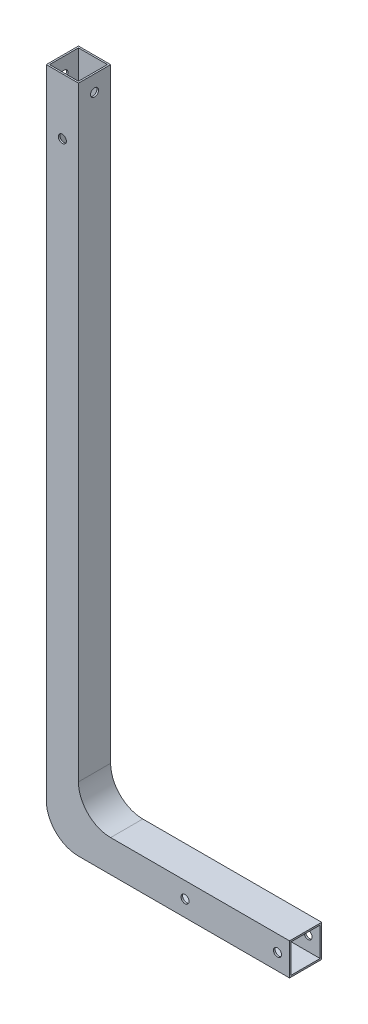
ISO-10303-21;
HEADER;
FILE_DESCRIPTION(('STEP AP214'),'2;1');
FILE_NAME('part.step','',(''),(''),'','','');
FILE_SCHEMA(('AUTOMOTIVE_DESIGN { 1 0 10303 214 1 1 1 1 }'));
ENDSEC;
DATA;
#1=APPLICATION_CONTEXT('core data for automotive mechanical design processes');
#2=APPLICATION_PROTOCOL_DEFINITION('international standard','automotive_design',2000,#1);
#3=PRODUCT_CONTEXT('',#1,'mechanical');
#4=PRODUCT('Part','Part','',(#3));
#5=PRODUCT_RELATED_PRODUCT_CATEGORY('part','',(#4));
#6=PRODUCT_DEFINITION_FORMATION('','',#4);
#7=PRODUCT_DEFINITION_CONTEXT('part definition',#1,'design');
#8=PRODUCT_DEFINITION('design','',#6,#7);
#9=PRODUCT_DEFINITION_SHAPE('','',#8);
#10=(LENGTH_UNIT() NAMED_UNIT(*) SI_UNIT(.MILLI.,.METRE.));
#11=(NAMED_UNIT(*) PLANE_ANGLE_UNIT() SI_UNIT($,.RADIAN.));
#12=(NAMED_UNIT(*) SI_UNIT($,.STERADIAN.) SOLID_ANGLE_UNIT());
#13=UNCERTAINTY_MEASURE_WITH_UNIT(LENGTH_MEASURE(1.E-05),#10,'distance_accuracy_value','');
#14=(GEOMETRIC_REPRESENTATION_CONTEXT(3) GLOBAL_UNCERTAINTY_ASSIGNED_CONTEXT((#13)) GLOBAL_UNIT_ASSIGNED_CONTEXT((#10,
#11,#12)) REPRESENTATION_CONTEXT('',''));
#15=CARTESIAN_POINT('',(0.,0.,0.));
#16=DIRECTION('',(0.,0.,1.));
#17=DIRECTION('',(1.,0.,0.));
#18=AXIS2_PLACEMENT_3D('',#15,#16,#17);
#19=CARTESIAN_POINT('',(50.8,50.8,0.));
#20=DIRECTION('',(0.,0.,-1.));
#21=DIRECTION('',(-1.,0.,0.));
#22=AXIS2_PLACEMENT_3D('',#19,#20,#21);
#23=PLANE('',#22);
#24=CARTESIAN_POINT('',(25.4,968.375,0.));
#25=DIRECTION('',(0.,0.,1.));
#26=DIRECTION('',(1.,0.,0.));
#27=AXIS2_PLACEMENT_3D('',#24,#25,#26);
#28=CIRCLE('',#27,6.34999999999995);
#29=CARTESIAN_POINT('',(31.7499999999999,968.375,0.));
#30=VERTEX_POINT('',#29);
#31=EDGE_CURVE('E621',#30,#30,#28,.T.);
#32=ORIENTED_EDGE('',*,*,#31,.T.);
#33=EDGE_LOOP('',(#32));
#34=FACE_BOUND('',#33,.T.);
#35=CARTESIAN_POINT('',(365.125,25.4,0.));
#36=DIRECTION('',(0.,0.,1.));
#37=DIRECTION('',(1.,0.,0.));
#38=AXIS2_PLACEMENT_3D('',#35,#36,#37);
#39=CIRCLE('',#38,6.34999999999997);
#40=CARTESIAN_POINT('',(371.475,25.4,0.));
#41=VERTEX_POINT('',#40);
#42=EDGE_CURVE('E333',#41,#41,#39,.T.);
#43=ORIENTED_EDGE('',*,*,#42,.T.);
#44=EDGE_LOOP('',(#43));
#45=FACE_BOUND('',#44,.T.);
#46=DIRECTION('',(-1.,0.,0.));
#47=VECTOR('',#46,1.);
#48=CARTESIAN_POINT('',(50.8000000000002,1057.275,0.));
#49=LINE('',#48,#47);
#50=CARTESIAN_POINT('',(50.8000000000002,1057.275,0.));
#51=VERTEX_POINT('',#50);
#52=CARTESIAN_POINT('',(1.66533453693773E-13,1057.275,0.));
#53=VERTEX_POINT('',#52);
#54=EDGE_CURVE('E238',#51,#53,#49,.T.);
#55=ORIENTED_EDGE('',*,*,#54,.F.);
#56=DIRECTION('',(0.,1.,0.));
#57=VECTOR('',#56,1.);
#58=CARTESIAN_POINT('',(50.8,101.6,0.));
#59=LINE('',#58,#57);
#60=CARTESIAN_POINT('',(50.8,101.6,0.));
#61=VERTEX_POINT('',#60);
#62=EDGE_CURVE('E252',#61,#51,#59,.T.);
#63=ORIENTED_EDGE('',*,*,#62,.F.);
#64=CARTESIAN_POINT('',(101.6,101.6,0.));
#65=DIRECTION('',(0.,0.,-1.));
#66=DIRECTION('',(1.,0.,0.));
#67=AXIS2_PLACEMENT_3D('',#64,#65,#66);
#68=CIRCLE('',#67,50.8);
#69=CARTESIAN_POINT('',(101.600000000001,50.8,0.));
#70=VERTEX_POINT('',#69);
#71=EDGE_CURVE('E292',#70,#61,#68,.T.);
#72=ORIENTED_EDGE('',*,*,#71,.F.);
#73=DIRECTION('',(-1.,0.,0.));
#74=VECTOR('',#73,1.);
#75=CARTESIAN_POINT('',(384.175000000001,50.8,0.));
#76=LINE('',#75,#74);
#77=CARTESIAN_POINT('',(384.175000000001,50.8,0.));
#78=VERTEX_POINT('',#77);
#79=EDGE_CURVE('E289',#78,#70,#76,.T.);
#80=ORIENTED_EDGE('',*,*,#79,.F.);
#81=DIRECTION('',(0.,1.,0.));
#82=VECTOR('',#81,1.);
#83=CARTESIAN_POINT('',(384.175000000001,0.,0.));
#84=LINE('',#83,#82);
#85=CARTESIAN_POINT('',(384.175000000001,0.,0.));
#86=VERTEX_POINT('',#85);
#87=EDGE_CURVE('E286',#86,#78,#84,.T.);
#88=ORIENTED_EDGE('',*,*,#87,.F.);
#89=DIRECTION('',(1.,0.,0.));
#90=VECTOR('',#89,1.);
#91=CARTESIAN_POINT('',(50.8000000000003,0.,0.));
#92=LINE('',#91,#90);
#93=CARTESIAN_POINT('',(50.8000000000003,0.,0.));
#94=VERTEX_POINT('',#93);
#95=EDGE_CURVE('E283',#94,#86,#92,.T.);
#96=ORIENTED_EDGE('',*,*,#95,.F.);
#97=CARTESIAN_POINT('',(50.8,50.8,0.));
#98=DIRECTION('',(0.,0.,1.));
#99=DIRECTION('',(-1.,0.,0.));
#100=AXIS2_PLACEMENT_3D('',#97,#98,#99);
#101=CIRCLE('',#100,50.8);
#102=CARTESIAN_POINT('',(0.,50.8000000000004,0.));
#103=VERTEX_POINT('',#102);
#104=EDGE_CURVE('E280',#103,#94,#101,.T.);
#105=ORIENTED_EDGE('',*,*,#104,.F.);
#106=DIRECTION('',(0.,-1.,0.));
#107=VECTOR('',#106,1.);
#108=CARTESIAN_POINT('',(1.66533453693773E-13,1057.275,0.));
#109=LINE('',#108,#107);
#110=EDGE_CURVE('E277',#53,#103,#109,.T.);
#111=ORIENTED_EDGE('',*,*,#110,.F.);
#112=EDGE_LOOP('',(#55,#63,#72,#80,#88,#96,#105,#111));
#113=FACE_BOUND('',#112,.T.);
#114=CARTESIAN_POINT('',(219.075,25.4,0.));
#115=DIRECTION('',(0.,0.,1.));
#116=DIRECTION('',(1.,0.,0.));
#117=AXIS2_PLACEMENT_3D('',#114,#115,#116);
#118=CIRCLE('',#117,6.34999999999999);
#119=CARTESIAN_POINT('',(225.425,25.4,0.));
#120=VERTEX_POINT('',#119);
#121=EDGE_CURVE('E328',#120,#120,#118,.T.);
#122=ORIENTED_EDGE('',*,*,#121,.T.);
#123=EDGE_LOOP('',(#122));
#124=FACE_BOUND('',#123,.T.);
#125=ADVANCED_FACE('F40',(#34,#45,#113,#124),#23,.T.);
#126=CARTESIAN_POINT('',(50.8,1057.275,50.8000000000001));
#127=DIRECTION('',(0.,-1.,0.));
#128=DIRECTION('',(0.,0.,-1.));
#129=AXIS2_PLACEMENT_3D('',#126,#127,#128);
#130=PLANE('',#129);
#131=ORIENTED_EDGE('',*,*,#54,.T.);
#132=DIRECTION('',(0.,0.,-1.));
#133=VECTOR('',#132,1.);
#134=CARTESIAN_POINT('',(0.,1057.275,50.8000000000001));
#135=LINE('',#134,#133);
#136=CARTESIAN_POINT('',(0.,1057.275,50.8000000000001));
#137=VERTEX_POINT('',#136);
#138=EDGE_CURVE('E11',#137,#53,#135,.T.);
#139=ORIENTED_EDGE('',*,*,#138,.F.);
#140=DIRECTION('',(-1.,0.,0.));
#141=VECTOR('',#140,1.);
#142=CARTESIAN_POINT('',(50.8,1057.275,50.8000000000001));
#143=LINE('',#142,#141);
#144=CARTESIAN_POINT('',(50.8,1057.275,50.8000000000001));
#145=VERTEX_POINT('',#144);
#146=EDGE_CURVE('E247',#145,#137,#143,.T.);
#147=ORIENTED_EDGE('',*,*,#146,.F.);
#148=DIRECTION('',(0.,0.,-1.));
#149=VECTOR('',#148,1.);
#150=CARTESIAN_POINT('',(50.8,1057.275,50.8000000000001));
#151=LINE('',#150,#149);
#152=EDGE_CURVE('E273',#145,#51,#151,.T.);
#153=ORIENTED_EDGE('',*,*,#152,.T.);
#154=EDGE_LOOP('',(#131,#139,#147,#153));
#155=FACE_BOUND('',#154,.T.);
#156=DIRECTION('',(-1.,0.,0.));
#157=VECTOR('',#156,1.);
#158=CARTESIAN_POINT('',(50.8000000000001,1057.275,2.54));
#159=LINE('',#158,#157);
#160=CARTESIAN_POINT('',(48.2600000000002,1057.275,2.54));
#161=VERTEX_POINT('',#160);
#162=CARTESIAN_POINT('',(2.54000000000015,1057.275,2.54));
#163=VERTEX_POINT('',#162);
#164=EDGE_CURVE('E184',#161,#163,#159,.T.);
#165=ORIENTED_EDGE('',*,*,#164,.F.);
#166=DIRECTION('',(0.,0.,-1.));
#167=VECTOR('',#166,1.);
#168=CARTESIAN_POINT('',(48.26,1057.275,50.8000000000001));
#169=LINE('',#168,#167);
#170=CARTESIAN_POINT('',(48.26,1057.275,48.2600000000001));
#171=VERTEX_POINT('',#170);
#172=EDGE_CURVE('E227',#171,#161,#169,.T.);
#173=ORIENTED_EDGE('',*,*,#172,.F.);
#174=DIRECTION('',(-1.,0.,0.));
#175=VECTOR('',#174,1.);
#176=CARTESIAN_POINT('',(50.8,1057.275,48.2600000000001));
#177=LINE('',#176,#175);
#178=CARTESIAN_POINT('',(2.53999999999999,1057.275,48.2600000000001));
#179=VERTEX_POINT('',#178);
#180=EDGE_CURVE('E66',#171,#179,#177,.T.);
#181=ORIENTED_EDGE('',*,*,#180,.T.);
#182=DIRECTION('',(0.,0.,-1.));
#183=VECTOR('',#182,1.);
#184=CARTESIAN_POINT('',(2.53999999999999,1057.275,50.8000000000001));
#185=LINE('',#184,#183);
#186=EDGE_CURVE('E196',#179,#163,#185,.T.);
#187=ORIENTED_EDGE('',*,*,#186,.T.);
#188=EDGE_LOOP('',(#165,#173,#181,#187));
#189=FACE_BOUND('',#188,.T.);
#190=ADVANCED_FACE('F42',(#155,#189),#130,.F.);
#191=CARTESIAN_POINT('',(0.,1057.275,50.8000000000001));
#192=DIRECTION('',(1.,0.,0.));
#193=DIRECTION('',(0.,0.,-1.));
#194=AXIS2_PLACEMENT_3D('',#191,#192,#193);
#195=PLANE('',#194);
#196=CARTESIAN_POINT('',(0.,1031.875,25.4));
#197=DIRECTION('',(-1.,0.,0.));
#198=DIRECTION('',(0.,0.,1.));
#199=AXIS2_PLACEMENT_3D('',#196,#197,#198);
#200=CIRCLE('',#199,6.35000000000008);
#201=CARTESIAN_POINT('',(0.,1031.875,31.7500000000001));
#202=VERTEX_POINT('',#201);
#203=EDGE_CURVE('E338',#202,#202,#200,.T.);
#204=ORIENTED_EDGE('',*,*,#203,.F.);
#205=EDGE_LOOP('',(#204));
#206=FACE_BOUND('',#205,.T.);
#207=ORIENTED_EDGE('',*,*,#110,.T.);
#208=DIRECTION('',(0.,0.,-1.));
#209=VECTOR('',#208,1.);
#210=CARTESIAN_POINT('',(0.,50.8000000000004,50.8000000000001));
#211=LINE('',#210,#209);
#212=CARTESIAN_POINT('',(0.,50.8000000000004,50.8000000000001));
#213=VERTEX_POINT('',#212);
#214=EDGE_CURVE('E50',#213,#103,#211,.T.);
#215=ORIENTED_EDGE('',*,*,#214,.F.);
#216=DIRECTION('',(0.,-1.,0.));
#217=VECTOR('',#216,1.);
#218=CARTESIAN_POINT('',(0.,1057.275,50.8000000000001));
#219=LINE('',#218,#217);
#220=EDGE_CURVE('E251',#137,#213,#219,.T.);
#221=ORIENTED_EDGE('',*,*,#220,.F.);
#222=ORIENTED_EDGE('',*,*,#138,.T.);
#223=EDGE_LOOP('',(#207,#215,#221,#222));
#224=FACE_BOUND('',#223,.T.);
#225=ADVANCED_FACE('F421',(#206,#224),#195,.F.);
#226=CARTESIAN_POINT('',(50.8,50.8,50.8000000000001));
#227=DIRECTION('',(0.,0.,-1.));
#228=DIRECTION('',(-1.,0.,0.));
#229=AXIS2_PLACEMENT_3D('',#226,#227,#228);
#230=CYLINDRICAL_SURFACE('',#229,50.8);
#231=ORIENTED_EDGE('',*,*,#104,.T.);
#232=DIRECTION('',(0.,0.,-1.));
#233=VECTOR('',#232,1.);
#234=CARTESIAN_POINT('',(50.8000000000003,0.,50.8000000000001));
#235=LINE('',#234,#233);
#236=CARTESIAN_POINT('',(50.8000000000003,0.,50.8000000000001));
#237=VERTEX_POINT('',#236);
#238=EDGE_CURVE('E316',#237,#94,#235,.T.);
#239=ORIENTED_EDGE('',*,*,#238,.F.);
#240=CARTESIAN_POINT('',(50.8,50.8,50.8000000000001));
#241=DIRECTION('',(0.,0.,1.));
#242=DIRECTION('',(-1.,0.,0.));
#243=AXIS2_PLACEMENT_3D('',#240,#241,#242);
#244=CIRCLE('',#243,50.8);
#245=EDGE_CURVE('E255',#213,#237,#244,.T.);
#246=ORIENTED_EDGE('',*,*,#245,.F.);
#247=ORIENTED_EDGE('',*,*,#214,.T.);
#248=EDGE_LOOP('',(#231,#239,#246,#247));
#249=FACE_BOUND('',#248,.T.);
#250=ADVANCED_FACE('F446',(#249),#230,.T.);
#251=CARTESIAN_POINT('',(50.8000000000004,0.,50.8000000000001));
#252=DIRECTION('',(0.,1.,0.));
#253=DIRECTION('',(0.,0.,1.));
#254=AXIS2_PLACEMENT_3D('',#251,#252,#253);
#255=PLANE('',#254);
#256=ORIENTED_EDGE('',*,*,#95,.T.);
#257=DIRECTION('',(0.,0.,-1.));
#258=VECTOR('',#257,1.);
#259=CARTESIAN_POINT('',(384.175000000001,0.,50.8000000000001));
#260=LINE('',#259,#258);
#261=CARTESIAN_POINT('',(384.175000000001,0.,50.8000000000001));
#262=VERTEX_POINT('',#261);
#263=EDGE_CURVE('E312',#262,#86,#260,.T.);
#264=ORIENTED_EDGE('',*,*,#263,.F.);
#265=DIRECTION('',(1.,0.,0.));
#266=VECTOR('',#265,1.);
#267=CARTESIAN_POINT('',(50.8000000000004,0.,50.8000000000001));
#268=LINE('',#267,#266);
#269=EDGE_CURVE('E258',#237,#262,#268,.T.);
#270=ORIENTED_EDGE('',*,*,#269,.F.);
#271=ORIENTED_EDGE('',*,*,#238,.T.);
#272=EDGE_LOOP('',(#256,#264,#270,#271));
#273=FACE_BOUND('',#272,.T.);
#274=ADVANCED_FACE('F443',(#273),#255,.F.);
#275=CARTESIAN_POINT('',(384.175000000001,0.,50.8000000000001));
#276=DIRECTION('',(-1.,0.,0.));
#277=DIRECTION('',(0.,0.,1.));
#278=AXIS2_PLACEMENT_3D('',#275,#276,#277);
#279=PLANE('',#278);
#280=DIRECTION('',(0.,0.,1.));
#281=VECTOR('',#280,1.);
#282=CARTESIAN_POINT('',(384.175000000001,48.26,2.54));
#283=LINE('',#282,#281);
#284=CARTESIAN_POINT('',(384.175000000001,48.26,2.54));
#285=VERTEX_POINT('',#284);
#286=CARTESIAN_POINT('',(384.175000000001,48.26,48.2600000000001));
#287=VERTEX_POINT('',#286);
#288=EDGE_CURVE('E169',#285,#287,#283,.T.);
#289=ORIENTED_EDGE('',*,*,#288,.F.);
#290=DIRECTION('',(0.,1.,0.));
#291=VECTOR('',#290,1.);
#292=CARTESIAN_POINT('',(384.175000000001,2.53999999999996,2.54));
#293=LINE('',#292,#291);
#294=CARTESIAN_POINT('',(384.175000000001,2.53999999999996,2.54));
#295=VERTEX_POINT('',#294);
#296=EDGE_CURVE('E174',#295,#285,#293,.T.);
#297=ORIENTED_EDGE('',*,*,#296,.F.);
#298=DIRECTION('',(0.,0.,-1.));
#299=VECTOR('',#298,1.);
#300=CARTESIAN_POINT('',(384.175000000001,2.53999999999996,2.54));
#301=LINE('',#300,#299);
#302=CARTESIAN_POINT('',(384.175000000001,2.53999999999996,48.2600000000001));
#303=VERTEX_POINT('',#302);
#304=EDGE_CURVE('E179',#303,#295,#301,.T.);
#305=ORIENTED_EDGE('',*,*,#304,.F.);
#306=DIRECTION('',(0.,-1.,0.));
#307=VECTOR('',#306,1.);
#308=CARTESIAN_POINT('',(384.175000000001,2.53999999999996,48.2600000000001));
#309=LINE('',#308,#307);
#310=EDGE_CURVE('E161',#287,#303,#309,.T.);
#311=ORIENTED_EDGE('',*,*,#310,.F.);
#312=EDGE_LOOP('',(#289,#297,#305,#311));
#313=FACE_BOUND('',#312,.T.);
#314=ORIENTED_EDGE('',*,*,#87,.T.);
#315=DIRECTION('',(0.,0.,-1.));
#316=VECTOR('',#315,1.);
#317=CARTESIAN_POINT('',(384.175000000001,50.8,50.8000000000001));
#318=LINE('',#317,#316);
#319=CARTESIAN_POINT('',(384.175000000001,50.8,50.8000000000001));
#320=VERTEX_POINT('',#319);
#321=EDGE_CURVE('E308',#320,#78,#318,.T.);
#322=ORIENTED_EDGE('',*,*,#321,.F.);
#323=DIRECTION('',(0.,1.,0.));
#324=VECTOR('',#323,1.);
#325=CARTESIAN_POINT('',(384.175000000001,0.,50.8000000000001));
#326=LINE('',#325,#324);
#327=EDGE_CURVE('E261',#262,#320,#326,.T.);
#328=ORIENTED_EDGE('',*,*,#327,.F.);
#329=ORIENTED_EDGE('',*,*,#263,.T.);
#330=EDGE_LOOP('',(#314,#322,#328,#329));
#331=FACE_BOUND('',#330,.T.);
#332=ADVANCED_FACE('F176',(#313,#331),#279,.F.);
#333=CARTESIAN_POINT('',(384.175000000001,50.8,50.8000000000001));
#334=DIRECTION('',(0.,-1.,0.));
#335=DIRECTION('',(1.,0.,0.));
#336=AXIS2_PLACEMENT_3D('',#333,#334,#335);
#337=PLANE('',#336);
#338=ORIENTED_EDGE('',*,*,#79,.T.);
#339=DIRECTION('',(0.,0.,-1.));
#340=VECTOR('',#339,1.);
#341=CARTESIAN_POINT('',(101.600000000001,50.8,50.8000000000001));
#342=LINE('',#341,#340);
#343=CARTESIAN_POINT('',(101.600000000001,50.8,50.8000000000001));
#344=VERTEX_POINT('',#343);
#345=EDGE_CURVE('E304',#344,#70,#342,.T.);
#346=ORIENTED_EDGE('',*,*,#345,.F.);
#347=DIRECTION('',(-1.,0.,0.));
#348=VECTOR('',#347,1.);
#349=CARTESIAN_POINT('',(384.175000000001,50.8,50.8000000000001));
#350=LINE('',#349,#348);
#351=EDGE_CURVE('E264',#320,#344,#350,.T.);
#352=ORIENTED_EDGE('',*,*,#351,.F.);
#353=ORIENTED_EDGE('',*,*,#321,.T.);
#354=EDGE_LOOP('',(#338,#346,#352,#353));
#355=FACE_BOUND('',#354,.T.);
#356=ADVANCED_FACE('F436',(#355),#337,.F.);
#357=CARTESIAN_POINT('',(101.6,101.6,50.8000000000001));
#358=DIRECTION('',(0.,0.,-1.));
#359=DIRECTION('',(-1.,0.,0.));
#360=AXIS2_PLACEMENT_3D('',#357,#358,#359);
#361=CYLINDRICAL_SURFACE('',#360,50.8);
#362=ORIENTED_EDGE('',*,*,#71,.T.);
#363=DIRECTION('',(0.,0.,-1.));
#364=VECTOR('',#363,1.);
#365=CARTESIAN_POINT('',(50.8,101.6,50.8000000000001));
#366=LINE('',#365,#364);
#367=CARTESIAN_POINT('',(50.8,101.6,50.8000000000001));
#368=VERTEX_POINT('',#367);
#369=EDGE_CURVE('E300',#368,#61,#366,.T.);
#370=ORIENTED_EDGE('',*,*,#369,.F.);
#371=CARTESIAN_POINT('',(101.6,101.6,50.8000000000001));
#372=DIRECTION('',(0.,0.,-1.));
#373=DIRECTION('',(1.,0.,0.));
#374=AXIS2_PLACEMENT_3D('',#371,#372,#373);
#375=CIRCLE('',#374,50.8);
#376=EDGE_CURVE('E267',#344,#368,#375,.T.);
#377=ORIENTED_EDGE('',*,*,#376,.F.);
#378=ORIENTED_EDGE('',*,*,#345,.T.);
#379=EDGE_LOOP('',(#362,#370,#377,#378));
#380=FACE_BOUND('',#379,.T.);
#381=ADVANCED_FACE('F432',(#380),#361,.F.);
#382=CARTESIAN_POINT('',(50.8,101.6,50.8000000000001));
#383=DIRECTION('',(-1.,0.,0.));
#384=DIRECTION('',(0.,0.,1.));
#385=AXIS2_PLACEMENT_3D('',#382,#383,#384);
#386=PLANE('',#385);
#387=CARTESIAN_POINT('',(50.8,1031.875,25.4));
#388=DIRECTION('',(-1.,0.,0.));
#389=DIRECTION('',(0.,0.,1.));
#390=AXIS2_PLACEMENT_3D('',#387,#388,#389);
#391=CIRCLE('',#390,6.34999999999997);
#392=CARTESIAN_POINT('',(50.8,1031.875,31.75));
#393=VERTEX_POINT('',#392);
#394=EDGE_CURVE('E345',#393,#393,#391,.T.);
#395=ORIENTED_EDGE('',*,*,#394,.T.);
#396=EDGE_LOOP('',(#395));
#397=FACE_BOUND('',#396,.T.);
#398=ORIENTED_EDGE('',*,*,#62,.T.);
#399=ORIENTED_EDGE('',*,*,#152,.F.);
#400=DIRECTION('',(0.,1.,0.));
#401=VECTOR('',#400,1.);
#402=CARTESIAN_POINT('',(50.8,101.6,50.8000000000001));
#403=LINE('',#402,#401);
#404=EDGE_CURVE('E270',#368,#145,#403,.T.);
#405=ORIENTED_EDGE('',*,*,#404,.F.);
#406=ORIENTED_EDGE('',*,*,#369,.T.);
#407=EDGE_LOOP('',(#398,#399,#405,#406));
#408=FACE_BOUND('',#407,.T.);
#409=ADVANCED_FACE('F429',(#397,#408),#386,.F.);
#410=CARTESIAN_POINT('',(50.8,50.8,50.8000000000001));
#411=DIRECTION('',(0.,0.,-1.));
#412=DIRECTION('',(-1.,0.,0.));
#413=AXIS2_PLACEMENT_3D('',#410,#411,#412);
#414=PLANE('',#413);
#415=CARTESIAN_POINT('',(25.4,968.375,50.8000000000001));
#416=DIRECTION('',(0.,0.,1.));
#417=DIRECTION('',(1.,0.,0.));
#418=AXIS2_PLACEMENT_3D('',#415,#416,#417);
#419=CIRCLE('',#418,6.34999999999999);
#420=CARTESIAN_POINT('',(31.75,968.375,50.8000000000001));
#421=VERTEX_POINT('',#420);
#422=EDGE_CURVE('E491',#421,#421,#419,.T.);
#423=ORIENTED_EDGE('',*,*,#422,.F.);
#424=EDGE_LOOP('',(#423));
#425=FACE_BOUND('',#424,.T.);
#426=CARTESIAN_POINT('',(365.125,25.4,50.8000000000001));
#427=DIRECTION('',(0.,0.,1.));
#428=DIRECTION('',(1.,0.,0.));
#429=AXIS2_PLACEMENT_3D('',#426,#427,#428);
#430=CIRCLE('',#429,6.34999999999997);
#431=CARTESIAN_POINT('',(371.475,25.4,50.8000000000001));
#432=VERTEX_POINT('',#431);
#433=EDGE_CURVE('E361',#432,#432,#430,.T.);
#434=ORIENTED_EDGE('',*,*,#433,.F.);
#435=EDGE_LOOP('',(#434));
#436=FACE_BOUND('',#435,.T.);
#437=CARTESIAN_POINT('',(219.075,25.4,50.8000000000001));
#438=DIRECTION('',(0.,0.,1.));
#439=DIRECTION('',(1.,0.,0.));
#440=AXIS2_PLACEMENT_3D('',#437,#438,#439);
#441=CIRCLE('',#440,6.34999999999999);
#442=CARTESIAN_POINT('',(225.425,25.4,50.8000000000001));
#443=VERTEX_POINT('',#442);
#444=EDGE_CURVE('E371',#443,#443,#441,.T.);
#445=ORIENTED_EDGE('',*,*,#444,.F.);
#446=EDGE_LOOP('',(#445));
#447=FACE_BOUND('',#446,.T.);
#448=ORIENTED_EDGE('',*,*,#146,.T.);
#449=ORIENTED_EDGE('',*,*,#220,.T.);
#450=ORIENTED_EDGE('',*,*,#245,.T.);
#451=ORIENTED_EDGE('',*,*,#269,.T.);
#452=ORIENTED_EDGE('',*,*,#327,.T.);
#453=ORIENTED_EDGE('',*,*,#351,.T.);
#454=ORIENTED_EDGE('',*,*,#376,.T.);
#455=ORIENTED_EDGE('',*,*,#404,.T.);
#456=EDGE_LOOP('',(#448,#449,#450,#451,#452,#453,#454,#455));
#457=FACE_BOUND('',#456,.T.);
#458=ADVANCED_FACE('F427',(#425,#436,#447,#457),#414,.F.);
#459=CARTESIAN_POINT('',(2.53999999999999,1057.275,50.8000000000001));
#460=DIRECTION('',(1.,0.,0.));
#461=DIRECTION('',(0.,0.,-1.));
#462=AXIS2_PLACEMENT_3D('',#459,#460,#461);
#463=PLANE('',#462);
#464=CARTESIAN_POINT('',(2.53999999999999,1031.875,25.4));
#465=DIRECTION('',(1.,0.,0.));
#466=DIRECTION('',(0.,0.,-1.));
#467=AXIS2_PLACEMENT_3D('',#464,#465,#466);
#468=CIRCLE('',#467,6.34999999999997);
#469=CARTESIAN_POINT('',(2.53999999999999,1031.875,19.0500000000001));
#470=VERTEX_POINT('',#469);
#471=EDGE_CURVE('E337',#470,#470,#468,.T.);
#472=ORIENTED_EDGE('',*,*,#471,.F.);
#473=EDGE_LOOP('',(#472));
#474=FACE_BOUND('',#473,.T.);
#475=DIRECTION('',(0.,-1.,0.));
#476=VECTOR('',#475,1.);
#477=CARTESIAN_POINT('',(2.53999999999999,50.8,2.54));
#478=LINE('',#477,#476);
#479=CARTESIAN_POINT('',(2.53999999999999,50.8000000000003,2.54));
#480=VERTEX_POINT('',#479);
#481=EDGE_CURVE('E188',#163,#480,#478,.T.);
#482=ORIENTED_EDGE('',*,*,#481,.F.);
#483=ORIENTED_EDGE('',*,*,#186,.F.);
#484=DIRECTION('',(0.,-1.,0.));
#485=VECTOR('',#484,1.);
#486=CARTESIAN_POINT('',(2.53999999999999,50.8,48.2600000000001));
#487=LINE('',#486,#485);
#488=CARTESIAN_POINT('',(2.53999999999999,50.8000000000003,48.2600000000001));
#489=VERTEX_POINT('',#488);
#490=EDGE_CURVE('E198',#179,#489,#487,.T.);
#491=ORIENTED_EDGE('',*,*,#490,.T.);
#492=DIRECTION('',(0.,0.,-1.));
#493=VECTOR('',#492,1.);
#494=CARTESIAN_POINT('',(2.53999999999999,50.8000000000003,50.8000000000001));
#495=LINE('',#494,#493);
#496=EDGE_CURVE('E192',#489,#480,#495,.T.);
#497=ORIENTED_EDGE('',*,*,#496,.T.);
#498=EDGE_LOOP('',(#482,#483,#491,#497));
#499=FACE_BOUND('',#498,.T.);
#500=ADVANCED_FACE('F395',(#474,#499),#463,.T.);
#501=CARTESIAN_POINT('',(50.8,50.8,50.8000000000001));
#502=DIRECTION('',(0.,0.,-1.));
#503=DIRECTION('',(-1.,0.,0.));
#504=AXIS2_PLACEMENT_3D('',#501,#502,#503);
#505=CYLINDRICAL_SURFACE('',#504,48.26);
#506=CARTESIAN_POINT('',(50.8,50.8,2.54));
#507=DIRECTION('',(0.,0.,-1.));
#508=DIRECTION('',(-1.,0.,0.));
#509=AXIS2_PLACEMENT_3D('',#506,#507,#508);
#510=CIRCLE('',#509,48.26);
#511=CARTESIAN_POINT('',(50.8000000000003,2.53999999999996,2.54));
#512=VERTEX_POINT('',#511);
#513=EDGE_CURVE('E191',#480,#512,#510,.F.);
#514=ORIENTED_EDGE('',*,*,#513,.F.);
#515=ORIENTED_EDGE('',*,*,#496,.F.);
#516=CARTESIAN_POINT('',(50.8,50.8,48.2600000000001));
#517=DIRECTION('',(0.,0.,-1.));
#518=DIRECTION('',(-1.,0.,0.));
#519=AXIS2_PLACEMENT_3D('',#516,#517,#518);
#520=CIRCLE('',#519,48.26);
#521=CARTESIAN_POINT('',(50.8000000000003,2.53999999999996,48.2600000000001));
#522=VERTEX_POINT('',#521);
#523=EDGE_CURVE('E201',#489,#522,#520,.F.);
#524=ORIENTED_EDGE('',*,*,#523,.T.);
#525=DIRECTION('',(0.,0.,1.));
#526=VECTOR('',#525,1.);
#527=CARTESIAN_POINT('',(50.8000000000003,2.53999999999996,50.8000000000001));
#528=LINE('',#527,#526);
#529=EDGE_CURVE('E197',#522,#512,#528,.F.);
#530=ORIENTED_EDGE('',*,*,#529,.T.);
#531=EDGE_LOOP('',(#514,#515,#524,#530));
#532=FACE_BOUND('',#531,.T.);
#533=ADVANCED_FACE('F393',(#532),#505,.F.);
#534=CARTESIAN_POINT('',(50.8000000000004,2.53999999999996,50.8000000000001));
#535=DIRECTION('',(0.,1.,0.));
#536=DIRECTION('',(0.,0.,1.));
#537=AXIS2_PLACEMENT_3D('',#534,#535,#536);
#538=PLANE('',#537);
#539=ORIENTED_EDGE('',*,*,#304,.T.);
#540=DIRECTION('',(1.,0.,0.));
#541=VECTOR('',#540,1.);
#542=CARTESIAN_POINT('',(50.8,2.53999999999996,2.54));
#543=LINE('',#542,#541);
#544=EDGE_CURVE('E204',#512,#295,#543,.T.);
#545=ORIENTED_EDGE('',*,*,#544,.F.);
#546=ORIENTED_EDGE('',*,*,#529,.F.);
#547=DIRECTION('',(1.,0.,0.));
#548=VECTOR('',#547,1.);
#549=CARTESIAN_POINT('',(50.8,2.53999999999996,48.2600000000001));
#550=LINE('',#549,#548);
#551=EDGE_CURVE('E166',#522,#303,#550,.T.);
#552=ORIENTED_EDGE('',*,*,#551,.T.);
#553=EDGE_LOOP('',(#539,#545,#546,#552));
#554=FACE_BOUND('',#553,.T.);
#555=ADVANCED_FACE('F388',(#554),#538,.T.);
#556=CARTESIAN_POINT('',(384.175000000001,48.26,50.8000000000001));
#557=DIRECTION('',(0.,-1.,0.));
#558=DIRECTION('',(1.,0.,0.));
#559=AXIS2_PLACEMENT_3D('',#556,#557,#558);
#560=PLANE('',#559);
#561=DIRECTION('',(-1.,0.,0.));
#562=VECTOR('',#561,1.);
#563=CARTESIAN_POINT('',(50.8,48.26,48.2600000000001));
#564=LINE('',#563,#562);
#565=CARTESIAN_POINT('',(101.600000000001,48.2599999999999,48.2600000000001));
#566=VERTEX_POINT('',#565);
#567=EDGE_CURVE('E157',#287,#566,#564,.T.);
#568=ORIENTED_EDGE('',*,*,#567,.T.);
#569=DIRECTION('',(0.,0.,-1.));
#570=VECTOR('',#569,1.);
#571=CARTESIAN_POINT('',(101.600000000001,48.2599999999999,50.8000000000001));
#572=LINE('',#571,#570);
#573=CARTESIAN_POINT('',(101.600000000001,48.2599999999999,2.54));
#574=VERTEX_POINT('',#573);
#575=EDGE_CURVE('E208',#566,#574,#572,.T.);
#576=ORIENTED_EDGE('',*,*,#575,.T.);
#577=DIRECTION('',(-1.,0.,0.));
#578=VECTOR('',#577,1.);
#579=CARTESIAN_POINT('',(50.8,48.26,2.54));
#580=LINE('',#579,#578);
#581=EDGE_CURVE('E58',#285,#574,#580,.T.);
#582=ORIENTED_EDGE('',*,*,#581,.F.);
#583=ORIENTED_EDGE('',*,*,#288,.T.);
#584=EDGE_LOOP('',(#568,#576,#582,#583));
#585=FACE_BOUND('',#584,.T.);
#586=ADVANCED_FACE('F170',(#585),#560,.T.);
#587=CARTESIAN_POINT('',(101.6,101.6,50.8000000000001));
#588=DIRECTION('',(0.,0.,-1.));
#589=DIRECTION('',(-1.,0.,0.));
#590=AXIS2_PLACEMENT_3D('',#587,#588,#589);
#591=CYLINDRICAL_SURFACE('',#590,53.34);
#592=CARTESIAN_POINT('',(101.6,101.6,2.54));
#593=DIRECTION('',(0.,0.,-1.));
#594=DIRECTION('',(-1.,0.,0.));
#595=AXIS2_PLACEMENT_3D('',#592,#593,#594);
#596=CIRCLE('',#595,53.34);
#597=CARTESIAN_POINT('',(48.26,101.6,2.54));
#598=VERTEX_POINT('',#597);
#599=EDGE_CURVE('E217',#574,#598,#596,.T.);
#600=ORIENTED_EDGE('',*,*,#599,.F.);
#601=ORIENTED_EDGE('',*,*,#575,.F.);
#602=CARTESIAN_POINT('',(101.6,101.6,48.2600000000001));
#603=DIRECTION('',(0.,0.,-1.));
#604=DIRECTION('',(-1.,0.,0.));
#605=AXIS2_PLACEMENT_3D('',#602,#603,#604);
#606=CIRCLE('',#605,53.34);
#607=CARTESIAN_POINT('',(48.26,101.6,48.2600000000001));
#608=VERTEX_POINT('',#607);
#609=EDGE_CURVE('E163',#566,#608,#606,.T.);
#610=ORIENTED_EDGE('',*,*,#609,.T.);
#611=DIRECTION('',(0.,0.,1.));
#612=VECTOR('',#611,1.);
#613=CARTESIAN_POINT('',(48.26,101.6,50.8000000000001));
#614=LINE('',#613,#612);
#615=EDGE_CURVE('E219',#608,#598,#614,.F.);
#616=ORIENTED_EDGE('',*,*,#615,.T.);
#617=EDGE_LOOP('',(#600,#601,#610,#616));
#618=FACE_BOUND('',#617,.T.);
#619=ADVANCED_FACE('F405',(#618),#591,.T.);
#620=CARTESIAN_POINT('',(48.26,101.6,50.8000000000001));
#621=DIRECTION('',(-1.,0.,0.));
#622=DIRECTION('',(0.,0.,1.));
#623=AXIS2_PLACEMENT_3D('',#620,#621,#622);
#624=PLANE('',#623);
#625=CARTESIAN_POINT('',(48.26,1031.875,25.4));
#626=DIRECTION('',(-1.,0.,0.));
#627=DIRECTION('',(0.,0.,1.));
#628=AXIS2_PLACEMENT_3D('',#625,#626,#627);
#629=CIRCLE('',#628,6.34999999999997);
#630=CARTESIAN_POINT('',(48.26,1031.875,31.75));
#631=VERTEX_POINT('',#630);
#632=EDGE_CURVE('E334',#631,#631,#629,.T.);
#633=ORIENTED_EDGE('',*,*,#632,.F.);
#634=EDGE_LOOP('',(#633));
#635=FACE_BOUND('',#634,.T.);
#636=DIRECTION('',(0.,1.,0.));
#637=VECTOR('',#636,1.);
#638=CARTESIAN_POINT('',(48.26,50.8,2.54));
#639=LINE('',#638,#637);
#640=EDGE_CURVE('E223',#598,#161,#639,.T.);
#641=ORIENTED_EDGE('',*,*,#640,.F.);
#642=ORIENTED_EDGE('',*,*,#615,.F.);
#643=DIRECTION('',(0.,1.,0.));
#644=VECTOR('',#643,1.);
#645=CARTESIAN_POINT('',(48.26,50.8,48.2600000000001));
#646=LINE('',#645,#644);
#647=EDGE_CURVE('E230',#608,#171,#646,.T.);
#648=ORIENTED_EDGE('',*,*,#647,.T.);
#649=ORIENTED_EDGE('',*,*,#172,.T.);
#650=EDGE_LOOP('',(#641,#642,#648,#649));
#651=FACE_BOUND('',#650,.T.);
#652=ADVANCED_FACE('F401',(#635,#651),#624,.T.);
#653=CARTESIAN_POINT('',(50.8,50.8,48.2600000000001));
#654=DIRECTION('',(0.,0.,-1.));
#655=DIRECTION('',(-1.,0.,0.));
#656=AXIS2_PLACEMENT_3D('',#653,#654,#655);
#657=PLANE('',#656);
#658=CARTESIAN_POINT('',(25.4,968.375,48.2600000000001));
#659=DIRECTION('',(0.,0.,-1.));
#660=DIRECTION('',(-1.,0.,0.));
#661=AXIS2_PLACEMENT_3D('',#658,#659,#660);
#662=CIRCLE('',#661,6.34999999999997);
#663=CARTESIAN_POINT('',(19.0500000000001,968.375,48.2600000000001));
#664=VERTEX_POINT('',#663);
#665=EDGE_CURVE('E348',#664,#664,#662,.T.);
#666=ORIENTED_EDGE('',*,*,#665,.F.);
#667=EDGE_LOOP('',(#666));
#668=FACE_BOUND('',#667,.T.);
#669=CARTESIAN_POINT('',(365.125,25.4,48.2600000000001));
#670=DIRECTION('',(0.,0.,-1.));
#671=DIRECTION('',(-1.,0.,0.));
#672=AXIS2_PLACEMENT_3D('',#669,#670,#671);
#673=CIRCLE('',#672,6.34999999999997);
#674=CARTESIAN_POINT('',(358.775,25.4,48.2600000000001));
#675=VERTEX_POINT('',#674);
#676=EDGE_CURVE('E332',#675,#675,#673,.T.);
#677=ORIENTED_EDGE('',*,*,#676,.F.);
#678=EDGE_LOOP('',(#677));
#679=FACE_BOUND('',#678,.T.);
#680=CARTESIAN_POINT('',(219.075,25.4,48.2600000000001));
#681=DIRECTION('',(0.,0.,-1.));
#682=DIRECTION('',(-1.,0.,0.));
#683=AXIS2_PLACEMENT_3D('',#680,#681,#682);
#684=CIRCLE('',#683,6.34999999999999);
#685=CARTESIAN_POINT('',(212.725,25.4,48.2600000000001));
#686=VERTEX_POINT('',#685);
#687=EDGE_CURVE('E327',#686,#686,#684,.T.);
#688=ORIENTED_EDGE('',*,*,#687,.F.);
#689=EDGE_LOOP('',(#688));
#690=FACE_BOUND('',#689,.T.);
#691=ORIENTED_EDGE('',*,*,#310,.T.);
#692=ORIENTED_EDGE('',*,*,#551,.F.);
#693=ORIENTED_EDGE('',*,*,#523,.F.);
#694=ORIENTED_EDGE('',*,*,#490,.F.);
#695=ORIENTED_EDGE('',*,*,#180,.F.);
#696=ORIENTED_EDGE('',*,*,#647,.F.);
#697=ORIENTED_EDGE('',*,*,#609,.F.);
#698=ORIENTED_EDGE('',*,*,#567,.F.);
#699=EDGE_LOOP('',(#691,#692,#693,#694,#695,#696,#697,#698));
#700=FACE_BOUND('',#699,.T.);
#701=ADVANCED_FACE('F158',(#668,#679,#690,#700),#657,.T.);
#702=CARTESIAN_POINT('',(50.8,50.8,2.54));
#703=DIRECTION('',(0.,0.,-1.));
#704=DIRECTION('',(-1.,0.,0.));
#705=AXIS2_PLACEMENT_3D('',#702,#703,#704);
#706=PLANE('',#705);
#707=CARTESIAN_POINT('',(25.4,968.375,2.54));
#708=DIRECTION('',(0.,0.,-1.));
#709=DIRECTION('',(-1.,0.,0.));
#710=AXIS2_PLACEMENT_3D('',#707,#708,#709);
#711=CIRCLE('',#710,6.34999999999997);
#712=CARTESIAN_POINT('',(19.05,968.375,2.54));
#713=VERTEX_POINT('',#712);
#714=EDGE_CURVE('E44',#713,#713,#711,.T.);
#715=ORIENTED_EDGE('',*,*,#714,.T.);
#716=EDGE_LOOP('',(#715));
#717=FACE_BOUND('',#716,.T.);
#718=CARTESIAN_POINT('',(365.125,25.4,2.54));
#719=DIRECTION('',(0.,0.,-1.));
#720=DIRECTION('',(-1.,0.,0.));
#721=AXIS2_PLACEMENT_3D('',#718,#719,#720);
#722=CIRCLE('',#721,6.34999999999997);
#723=CARTESIAN_POINT('',(358.775,25.4,2.54));
#724=VERTEX_POINT('',#723);
#725=EDGE_CURVE('E329',#724,#724,#722,.T.);
#726=ORIENTED_EDGE('',*,*,#725,.T.);
#727=EDGE_LOOP('',(#726));
#728=FACE_BOUND('',#727,.T.);
#729=CARTESIAN_POINT('',(219.075,25.4,2.54));
#730=DIRECTION('',(0.,0.,-1.));
#731=DIRECTION('',(-1.,0.,0.));
#732=AXIS2_PLACEMENT_3D('',#729,#730,#731);
#733=CIRCLE('',#732,6.34999999999999);
#734=CARTESIAN_POINT('',(212.725,25.4,2.54));
#735=VERTEX_POINT('',#734);
#736=EDGE_CURVE('E323',#735,#735,#733,.T.);
#737=ORIENTED_EDGE('',*,*,#736,.T.);
#738=EDGE_LOOP('',(#737));
#739=FACE_BOUND('',#738,.T.);
#740=ORIENTED_EDGE('',*,*,#581,.T.);
#741=ORIENTED_EDGE('',*,*,#599,.T.);
#742=ORIENTED_EDGE('',*,*,#640,.T.);
#743=ORIENTED_EDGE('',*,*,#164,.T.);
#744=ORIENTED_EDGE('',*,*,#481,.T.);
#745=ORIENTED_EDGE('',*,*,#513,.T.);
#746=ORIENTED_EDGE('',*,*,#544,.T.);
#747=ORIENTED_EDGE('',*,*,#296,.T.);
#748=EDGE_LOOP('',(#740,#741,#742,#743,#744,#745,#746,#747));
#749=FACE_BOUND('',#748,.T.);
#750=ADVANCED_FACE('F383',(#717,#728,#739,#749),#706,.F.);
#751=CARTESIAN_POINT('',(219.075,25.4,50.8000000000001));
#752=DIRECTION('',(0.,0.,1.));
#753=DIRECTION('',(1.,0.,0.));
#754=AXIS2_PLACEMENT_3D('',#751,#752,#753);
#755=CYLINDRICAL_SURFACE('',#754,6.34999999999999);
#756=ORIENTED_EDGE('',*,*,#121,.F.);
#757=EDGE_LOOP('',(#756));
#758=FACE_BOUND('',#757,.T.);
#759=ORIENTED_EDGE('',*,*,#736,.F.);
#760=EDGE_LOOP('',(#759));
#761=FACE_BOUND('',#760,.T.);
#762=ADVANCED_FACE('F499',(#758,#761),#755,.F.);
#763=ORIENTED_EDGE('',*,*,#687,.T.);
#764=EDGE_LOOP('',(#763));
#765=FACE_BOUND('',#764,.T.);
#766=ORIENTED_EDGE('',*,*,#444,.T.);
#767=EDGE_LOOP('',(#766));
#768=FACE_BOUND('',#767,.T.);
#769=ADVANCED_FACE('F496',(#765,#768),#755,.F.);
#770=CARTESIAN_POINT('',(365.125,25.4,50.8000000000001));
#771=DIRECTION('',(0.,0.,1.));
#772=DIRECTION('',(1.,0.,0.));
#773=AXIS2_PLACEMENT_3D('',#770,#771,#772);
#774=CYLINDRICAL_SURFACE('',#773,6.34999999999997);
#775=ORIENTED_EDGE('',*,*,#42,.F.);
#776=EDGE_LOOP('',(#775));
#777=FACE_BOUND('',#776,.T.);
#778=ORIENTED_EDGE('',*,*,#725,.F.);
#779=EDGE_LOOP('',(#778));
#780=FACE_BOUND('',#779,.T.);
#781=ADVANCED_FACE('F498',(#777,#780),#774,.F.);
#782=ORIENTED_EDGE('',*,*,#676,.T.);
#783=EDGE_LOOP('',(#782));
#784=FACE_BOUND('',#783,.T.);
#785=ORIENTED_EDGE('',*,*,#433,.T.);
#786=EDGE_LOOP('',(#785));
#787=FACE_BOUND('',#786,.T.);
#788=ADVANCED_FACE('F506',(#784,#787),#774,.F.);
#789=CARTESIAN_POINT('',(0.,1031.875,25.4));
#790=DIRECTION('',(-1.,0.,0.));
#791=DIRECTION('',(0.,0.,1.));
#792=AXIS2_PLACEMENT_3D('',#789,#790,#791);
#793=CYLINDRICAL_SURFACE('',#792,6.34999999999997);
#794=ORIENTED_EDGE('',*,*,#632,.T.);
#795=EDGE_LOOP('',(#794));
#796=FACE_BOUND('',#795,.T.);
#797=ORIENTED_EDGE('',*,*,#394,.F.);
#798=EDGE_LOOP('',(#797));
#799=FACE_BOUND('',#798,.T.);
#800=ADVANCED_FACE('F579',(#796,#799),#793,.F.);
#801=ORIENTED_EDGE('',*,*,#471,.T.);
#802=EDGE_LOOP('',(#801));
#803=FACE_BOUND('',#802,.T.);
#804=ORIENTED_EDGE('',*,*,#203,.T.);
#805=EDGE_LOOP('',(#804));
#806=FACE_BOUND('',#805,.T.);
#807=ADVANCED_FACE('F588',(#803,#806),#793,.F.);
#808=CARTESIAN_POINT('',(25.4,968.375,50.8000000000001));
#809=DIRECTION('',(0.,0.,1.));
#810=DIRECTION('',(1.,0.,0.));
#811=AXIS2_PLACEMENT_3D('',#808,#809,#810);
#812=CYLINDRICAL_SURFACE('',#811,6.34999999999997);
#813=ORIENTED_EDGE('',*,*,#31,.F.);
#814=EDGE_LOOP('',(#813));
#815=FACE_BOUND('',#814,.T.);
#816=ORIENTED_EDGE('',*,*,#714,.F.);
#817=EDGE_LOOP('',(#816));
#818=FACE_BOUND('',#817,.T.);
#819=ADVANCED_FACE('F596',(#815,#818),#812,.F.);
#820=ORIENTED_EDGE('',*,*,#665,.T.);
#821=EDGE_LOOP('',(#820));
#822=FACE_BOUND('',#821,.T.);
#823=ORIENTED_EDGE('',*,*,#422,.T.);
#824=EDGE_LOOP('',(#823));
#825=FACE_BOUND('',#824,.T.);
#826=ADVANCED_FACE('F605',(#822,#825),#812,.F.);
#827=CLOSED_SHELL('',(#125,#190,#225,#250,#274,#332,#356,#381,#409,#458,#500,#533,#555,#586,
#619,#652,#701,#750,#762,#769,#781,#788,#800,#807,#819,#826));
#828=MANIFOLD_SOLID_BREP('B2',#827);
#829=ADVANCED_BREP_SHAPE_REPRESENTATION('',(#18,#828),#14);
#830=SHAPE_DEFINITION_REPRESENTATION(#9,#829);
ENDSEC;
END-ISO-10303-21;
